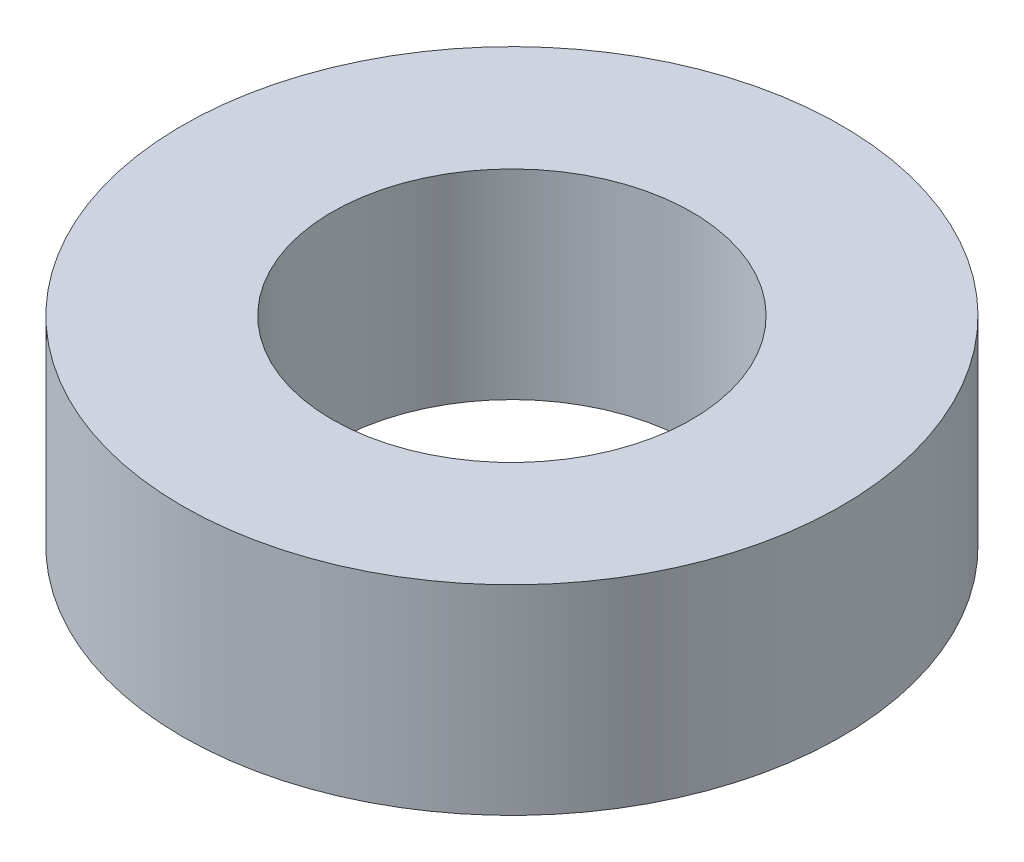
ISO-10303-21;
HEADER;
FILE_DESCRIPTION(('STEP AP214'),'2;1');
FILE_NAME('part.step','',(''),(''),'','','');
FILE_SCHEMA(('AUTOMOTIVE_DESIGN { 1 0 10303 214 1 1 1 1 }'));
ENDSEC;
DATA;
#1=APPLICATION_CONTEXT('core data for automotive mechanical design processes');
#2=APPLICATION_PROTOCOL_DEFINITION('international standard','automotive_design',2000,#1);
#3=PRODUCT_CONTEXT('',#1,'mechanical');
#4=PRODUCT('Part','Part','',(#3));
#5=PRODUCT_RELATED_PRODUCT_CATEGORY('part','',(#4));
#6=PRODUCT_DEFINITION_FORMATION('','',#4);
#7=PRODUCT_DEFINITION_CONTEXT('part definition',#1,'design');
#8=PRODUCT_DEFINITION('design','',#6,#7);
#9=PRODUCT_DEFINITION_SHAPE('','',#8);
#10=(LENGTH_UNIT() NAMED_UNIT(*) SI_UNIT(.MILLI.,.METRE.));
#11=(NAMED_UNIT(*) PLANE_ANGLE_UNIT() SI_UNIT($,.RADIAN.));
#12=(NAMED_UNIT(*) SI_UNIT($,.STERADIAN.) SOLID_ANGLE_UNIT());
#13=UNCERTAINTY_MEASURE_WITH_UNIT(LENGTH_MEASURE(1.E-05),#10,'distance_accuracy_value','');
#14=(GEOMETRIC_REPRESENTATION_CONTEXT(3) GLOBAL_UNCERTAINTY_ASSIGNED_CONTEXT((#13)) GLOBAL_UNIT_ASSIGNED_CONTEXT((#10,
#11,#12)) REPRESENTATION_CONTEXT('',''));
#15=CARTESIAN_POINT('',(0.,0.,0.));
#16=DIRECTION('',(0.,0.,1.));
#17=DIRECTION('',(1.,0.,0.));
#18=AXIS2_PLACEMENT_3D('',#15,#16,#17);
#19=CARTESIAN_POINT('',(0.,2.,0.));
#20=DIRECTION('',(0.,1.,0.));
#21=DIRECTION('',(0.,0.,1.));
#22=AXIS2_PLACEMENT_3D('',#19,#20,#21);
#23=PLANE('',#22);
#24=CARTESIAN_POINT('',(0.,2.,0.));
#25=DIRECTION('',(0.,1.,0.));
#26=DIRECTION('',(0.,0.,1.));
#27=AXIS2_PLACEMENT_3D('',#24,#25,#26);
#28=CIRCLE('',#27,3.3);
#29=CARTESIAN_POINT('',(0.,2.,3.3));
#30=VERTEX_POINT('',#29);
#31=EDGE_CURVE('E10',#30,#30,#28,.T.);
#32=ORIENTED_EDGE('',*,*,#31,.T.);
#33=EDGE_LOOP('',(#32));
#34=FACE_BOUND('',#33,.T.);
#35=CARTESIAN_POINT('',(0.,2.,0.));
#36=DIRECTION('',(0.,1.,0.));
#37=DIRECTION('',(0.,0.,1.));
#38=AXIS2_PLACEMENT_3D('',#35,#36,#37);
#39=CIRCLE('',#38,1.8);
#40=CARTESIAN_POINT('',(0.,2.,1.8));
#41=VERTEX_POINT('',#40);
#42=EDGE_CURVE('E42',#41,#41,#39,.T.);
#43=ORIENTED_EDGE('',*,*,#42,.F.);
#44=EDGE_LOOP('',(#43));
#45=FACE_BOUND('',#44,.T.);
#46=ADVANCED_FACE('F31',(#34,#45),#23,.T.);
#47=CARTESIAN_POINT('',(0.,0.,0.));
#48=DIRECTION('',(0.,1.,0.));
#49=DIRECTION('',(0.,0.,1.));
#50=AXIS2_PLACEMENT_3D('',#47,#48,#49);
#51=PLANE('',#50);
#52=CARTESIAN_POINT('',(0.,0.,0.));
#53=DIRECTION('',(0.,1.,0.));
#54=DIRECTION('',(0.,0.,1.));
#55=AXIS2_PLACEMENT_3D('',#52,#53,#54);
#56=CIRCLE('',#55,3.3);
#57=CARTESIAN_POINT('',(0.,0.,3.3));
#58=VERTEX_POINT('',#57);
#59=EDGE_CURVE('E35',#58,#58,#56,.T.);
#60=ORIENTED_EDGE('',*,*,#59,.F.);
#61=EDGE_LOOP('',(#60));
#62=FACE_BOUND('',#61,.T.);
#63=CARTESIAN_POINT('',(0.,0.,0.));
#64=DIRECTION('',(0.,1.,0.));
#65=DIRECTION('',(0.,0.,1.));
#66=AXIS2_PLACEMENT_3D('',#63,#64,#65);
#67=CIRCLE('',#66,1.8);
#68=CARTESIAN_POINT('',(0.,0.,1.8));
#69=VERTEX_POINT('',#68);
#70=EDGE_CURVE('E44',#69,#69,#67,.T.);
#71=ORIENTED_EDGE('',*,*,#70,.T.);
#72=EDGE_LOOP('',(#71));
#73=FACE_BOUND('',#72,.T.);
#74=ADVANCED_FACE('F54',(#62,#73),#51,.F.);
#75=CARTESIAN_POINT('',(0.,2.,0.));
#76=DIRECTION('',(0.,-1.,0.));
#77=DIRECTION('',(0.,0.,-1.));
#78=AXIS2_PLACEMENT_3D('',#75,#76,#77);
#79=CYLINDRICAL_SURFACE('',#78,3.3);
#80=ORIENTED_EDGE('',*,*,#31,.F.);
#81=EDGE_LOOP('',(#80));
#82=FACE_BOUND('',#81,.T.);
#83=ORIENTED_EDGE('',*,*,#59,.T.);
#84=EDGE_LOOP('',(#83));
#85=FACE_BOUND('',#84,.T.);
#86=ADVANCED_FACE('F33',(#82,#85),#79,.T.);
#87=CARTESIAN_POINT('',(0.,2.,0.));
#88=DIRECTION('',(0.,-1.,0.));
#89=DIRECTION('',(0.,0.,-1.));
#90=AXIS2_PLACEMENT_3D('',#87,#88,#89);
#91=CYLINDRICAL_SURFACE('',#90,1.8);
#92=ORIENTED_EDGE('',*,*,#42,.T.);
#93=EDGE_LOOP('',(#92));
#94=FACE_BOUND('',#93,.T.);
#95=ORIENTED_EDGE('',*,*,#70,.F.);
#96=EDGE_LOOP('',(#95));
#97=FACE_BOUND('',#96,.T.);
#98=ADVANCED_FACE('F50',(#94,#97),#91,.F.);
#99=CLOSED_SHELL('',(#46,#74,#86,#98));
#100=MANIFOLD_SOLID_BREP('B2',#99);
#101=ADVANCED_BREP_SHAPE_REPRESENTATION('',(#18,#100),#14);
#102=SHAPE_DEFINITION_REPRESENTATION(#9,#101);
ENDSEC;
END-ISO-10303-21;
